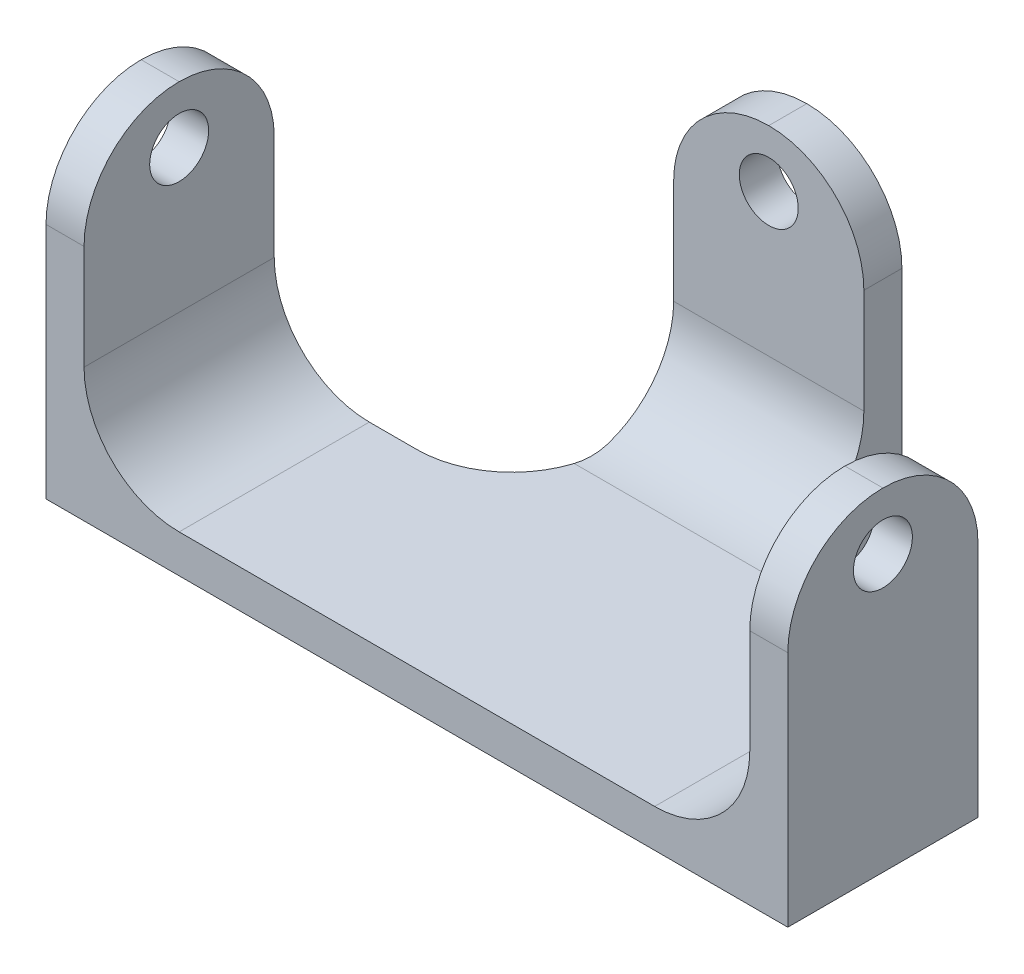
ISO-10303-21;
HEADER;
FILE_DESCRIPTION(('STEP AP214'),'2;1');
FILE_NAME('part.step','',(''),(''),'','','');
FILE_SCHEMA(('AUTOMOTIVE_DESIGN { 1 0 10303 214 1 1 1 1 }'));
ENDSEC;
DATA;
#1=APPLICATION_CONTEXT('core data for automotive mechanical design processes');
#2=APPLICATION_PROTOCOL_DEFINITION('international standard','automotive_design',2000,#1);
#3=PRODUCT_CONTEXT('',#1,'mechanical');
#4=PRODUCT('Part','Part','',(#3));
#5=PRODUCT_RELATED_PRODUCT_CATEGORY('part','',(#4));
#6=PRODUCT_DEFINITION_FORMATION('','',#4);
#7=PRODUCT_DEFINITION_CONTEXT('part definition',#1,'design');
#8=PRODUCT_DEFINITION('design','',#6,#7);
#9=PRODUCT_DEFINITION_SHAPE('','',#8);
#10=(LENGTH_UNIT() NAMED_UNIT(*) SI_UNIT(.MILLI.,.METRE.));
#11=(NAMED_UNIT(*) PLANE_ANGLE_UNIT() SI_UNIT($,.RADIAN.));
#12=(NAMED_UNIT(*) SI_UNIT($,.STERADIAN.) SOLID_ANGLE_UNIT());
#13=UNCERTAINTY_MEASURE_WITH_UNIT(LENGTH_MEASURE(1.E-05),#10,'distance_accuracy_value','');
#14=(GEOMETRIC_REPRESENTATION_CONTEXT(3) GLOBAL_UNCERTAINTY_ASSIGNED_CONTEXT((#13)) GLOBAL_UNIT_ASSIGNED_CONTEXT((#10,
#11,#12)) REPRESENTATION_CONTEXT('',''));
#15=CARTESIAN_POINT('',(0.,0.,0.));
#16=DIRECTION('',(0.,0.,1.));
#17=DIRECTION('',(1.,0.,0.));
#18=AXIS2_PLACEMENT_3D('',#15,#16,#17);
#19=CARTESIAN_POINT('',(-6.63941409911649,-24.1824796838979,62.));
#20=DIRECTION('',(0.,-1.,0.));
#21=DIRECTION('',(1.,0.,0.));
#22=AXIS2_PLACEMENT_3D('',#19,#20,#21);
#23=PLANE('',#22);
#24=DIRECTION('',(1.,0.,0.));
#25=VECTOR('',#24,1.);
#26=CARTESIAN_POINT('',(18.3605859008835,-24.1824796838979,14.));
#27=LINE('',#26,#25);
#28=CARTESIAN_POINT('',(38.821193886714,-24.1824796838979,14.));
#29=VERTEX_POINT('',#28);
#30=CARTESIAN_POINT('',(17.899977915053,-24.1824796838979,14.));
#31=VERTEX_POINT('',#30);
#32=EDGE_CURVE('E53',#29,#31,#27,.F.);
#33=ORIENTED_EDGE('',*,*,#32,.T.);
#34=CARTESIAN_POINT('',(8.36058590088351,-24.1824796838979,11.));
#35=DIRECTION('',(0.,-1.,0.));
#36=DIRECTION('',(1.,0.,0.));
#37=AXIS2_PLACEMENT_3D('',#34,#35,#36);
#38=CIRCLE('',#37,10.);
#39=CARTESIAN_POINT('',(8.36058590088351,-24.1824796838979,21.));
#40=VERTEX_POINT('',#39);
#41=EDGE_CURVE('E318',#31,#40,#38,.T.);
#42=ORIENTED_EDGE('',*,*,#41,.T.);
#43=DIRECTION('',(-1.,0.,0.));
#44=VECTOR('',#43,1.);
#45=CARTESIAN_POINT('',(-6.63941409911649,-24.1824796838979,21.));
#46=LINE('',#45,#44);
#47=CARTESIAN_POINT('',(3.3605859008835,-24.1824796838979,21.));
#48=VERTEX_POINT('',#47);
#49=EDGE_CURVE('E396',#40,#48,#46,.T.);
#50=ORIENTED_EDGE('',*,*,#49,.T.);
#51=DIRECTION('',(0.,0.,-1.));
#52=VECTOR('',#51,1.);
#53=CARTESIAN_POINT('',(3.3605859008835,-24.1824796838979,41.));
#54=LINE('',#53,#52);
#55=CARTESIAN_POINT('',(3.3605859008835,-24.1824796838979,41.));
#56=VERTEX_POINT('',#55);
#57=EDGE_CURVE('E274',#48,#56,#54,.F.);
#58=ORIENTED_EDGE('',*,*,#57,.T.);
#59=DIRECTION('',(1.,0.,0.));
#60=VECTOR('',#59,1.);
#61=CARTESIAN_POINT('',(-6.63941409911649,-24.1824796838979,41.));
#62=LINE('',#61,#60);
#63=CARTESIAN_POINT('',(53.3605859008835,-24.1824796838979,41.));
#64=VERTEX_POINT('',#63);
#65=EDGE_CURVE('E391',#56,#64,#62,.T.);
#66=ORIENTED_EDGE('',*,*,#65,.T.);
#67=DIRECTION('',(0.,0.,-1.));
#68=VECTOR('',#67,1.);
#69=CARTESIAN_POINT('',(53.3605859008835,-24.1824796838979,21.));
#70=LINE('',#69,#68);
#71=CARTESIAN_POINT('',(53.3605859008835,-24.1824796838979,21.));
#72=VERTEX_POINT('',#71);
#73=EDGE_CURVE('E270',#64,#72,#70,.T.);
#74=ORIENTED_EDGE('',*,*,#73,.T.);
#75=DIRECTION('',(-1.,0.,0.));
#76=VECTOR('',#75,1.);
#77=CARTESIAN_POINT('',(-6.63941409911649,-24.1824796838979,21.));
#78=LINE('',#77,#76);
#79=CARTESIAN_POINT('',(48.3605859008835,-24.1824796838979,21.));
#80=VERTEX_POINT('',#79);
#81=EDGE_CURVE('E406',#72,#80,#78,.T.);
#82=ORIENTED_EDGE('',*,*,#81,.T.);
#83=CARTESIAN_POINT('',(48.3605859008835,-24.1824796838979,11.));
#84=DIRECTION('',(0.,-1.,0.));
#85=DIRECTION('',(1.,0.,0.));
#86=AXIS2_PLACEMENT_3D('',#83,#84,#85);
#87=CIRCLE('',#86,10.);
#88=EDGE_CURVE('E47',#80,#29,#87,.T.);
#89=ORIENTED_EDGE('',*,*,#88,.T.);
#90=EDGE_LOOP('',(#33,#42,#50,#58,#66,#74,#82,#89));
#91=FACE_BOUND('',#90,.T.);
#92=ADVANCED_FACE('F33',(#91),#23,.F.);
#93=CARTESIAN_POINT('',(-10.6394140991165,-28.1824796838979,62.));
#94=DIRECTION('',(1.,0.,0.));
#95=DIRECTION('',(0.,1.,0.));
#96=AXIS2_PLACEMENT_3D('',#93,#94,#95);
#97=PLANE('',#96);
#98=CARTESIAN_POINT('',(-10.6394140991165,0.817520316102066,31.));
#99=DIRECTION('',(1.,0.,0.));
#100=DIRECTION('',(0.,1.,0.));
#101=AXIS2_PLACEMENT_3D('',#98,#99,#100);
#102=CIRCLE('',#101,3.1);
#103=CARTESIAN_POINT('',(-10.6394140991165,3.91752031610207,31.));
#104=VERTEX_POINT('',#103);
#105=EDGE_CURVE('E223',#104,#104,#102,.T.);
#106=ORIENTED_EDGE('',*,*,#105,.T.);
#107=EDGE_LOOP('',(#106));
#108=FACE_BOUND('',#107,.T.);
#109=CARTESIAN_POINT('',(-10.6394140991165,-3.18247968389794,31.));
#110=DIRECTION('',(1.,0.,0.));
#111=DIRECTION('',(0.,1.,0.));
#112=AXIS2_PLACEMENT_3D('',#109,#110,#111);
#113=CIRCLE('',#112,10.);
#114=CARTESIAN_POINT('',(-10.6394140991165,-3.18247968389794,41.));
#115=VERTEX_POINT('',#114);
#116=CARTESIAN_POINT('',(-10.6394140991165,6.81752031610207,31.));
#117=VERTEX_POINT('',#116);
#118=EDGE_CURVE('E240',#115,#117,#113,.F.);
#119=ORIENTED_EDGE('',*,*,#118,.T.);
#120=CARTESIAN_POINT('',(-10.6394140991165,-3.18247968389794,31.));
#121=DIRECTION('',(1.,0.,0.));
#122=DIRECTION('',(0.,1.,0.));
#123=AXIS2_PLACEMENT_3D('',#120,#121,#122);
#124=CIRCLE('',#123,10.);
#125=CARTESIAN_POINT('',(-10.6394140991165,-3.18247968389794,21.));
#126=VERTEX_POINT('',#125);
#127=EDGE_CURVE('E242',#117,#126,#124,.F.);
#128=ORIENTED_EDGE('',*,*,#127,.T.);
#129=DIRECTION('',(0.,-1.,0.));
#130=VECTOR('',#129,1.);
#131=CARTESIAN_POINT('',(-10.6394140991165,6.81752031610207,21.));
#132=LINE('',#131,#130);
#133=CARTESIAN_POINT('',(-10.6394140991165,-28.1824796838979,21.));
#134=VERTEX_POINT('',#133);
#135=EDGE_CURVE('E206',#126,#134,#132,.T.);
#136=ORIENTED_EDGE('',*,*,#135,.T.);
#137=DIRECTION('',(0.,0.,-1.));
#138=VECTOR('',#137,1.);
#139=CARTESIAN_POINT('',(-10.6394140991165,-28.1824796838979,62.));
#140=LINE('',#139,#138);
#141=CARTESIAN_POINT('',(-10.6394140991165,-28.1824796838979,41.));
#142=VERTEX_POINT('',#141);
#143=EDGE_CURVE('E202',#142,#134,#140,.T.);
#144=ORIENTED_EDGE('',*,*,#143,.F.);
#145=DIRECTION('',(0.,-1.,0.));
#146=VECTOR('',#145,1.);
#147=CARTESIAN_POINT('',(-10.6394140991165,6.81752031610207,41.));
#148=LINE('',#147,#146);
#149=EDGE_CURVE('E184',#115,#142,#148,.T.);
#150=ORIENTED_EDGE('',*,*,#149,.F.);
#151=EDGE_LOOP('',(#119,#128,#136,#144,#150));
#152=FACE_BOUND('',#151,.T.);
#153=ADVANCED_FACE('F209',(#108,#152),#97,.F.);
#154=CARTESIAN_POINT('',(67.3605859008835,-28.1824796838979,62.));
#155=DIRECTION('',(0.,1.,0.));
#156=DIRECTION('',(-1.,0.,0.));
#157=AXIS2_PLACEMENT_3D('',#154,#155,#156);
#158=PLANE('',#157);
#159=DIRECTION('',(0.,0.,-1.));
#160=VECTOR('',#159,1.);
#161=CARTESIAN_POINT('',(67.3605859008835,-28.1824796838979,62.));
#162=LINE('',#161,#160);
#163=CARTESIAN_POINT('',(67.3605859008835,-28.1824796838979,41.));
#164=VERTEX_POINT('',#163);
#165=CARTESIAN_POINT('',(67.3605859008835,-28.1824796838979,21.));
#166=VERTEX_POINT('',#165);
#167=EDGE_CURVE('E205',#164,#166,#162,.T.);
#168=ORIENTED_EDGE('',*,*,#167,.F.);
#169=DIRECTION('',(1.,0.,0.));
#170=VECTOR('',#169,1.);
#171=CARTESIAN_POINT('',(-10.6394140991165,-28.1824796838979,41.));
#172=LINE('',#171,#170);
#173=EDGE_CURVE('E188',#142,#164,#172,.T.);
#174=ORIENTED_EDGE('',*,*,#173,.F.);
#175=ORIENTED_EDGE('',*,*,#143,.T.);
#176=DIRECTION('',(-1.,0.,0.));
#177=VECTOR('',#176,1.);
#178=CARTESIAN_POINT('',(-10.6394140991165,-28.1824796838979,21.));
#179=LINE('',#178,#177);
#180=CARTESIAN_POINT('',(8.36058590088351,-28.1824796838979,21.));
#181=VERTEX_POINT('',#180);
#182=EDGE_CURVE('E442',#181,#134,#179,.T.);
#183=ORIENTED_EDGE('',*,*,#182,.F.);
#184=CARTESIAN_POINT('',(8.36058590088351,-28.1824796838979,11.));
#185=DIRECTION('',(0.,1.,0.));
#186=DIRECTION('',(-1.,0.,0.));
#187=AXIS2_PLACEMENT_3D('',#184,#185,#186);
#188=CIRCLE('',#187,10.);
#189=CARTESIAN_POINT('',(18.3605859008835,-28.1824796838979,11.));
#190=VERTEX_POINT('',#189);
#191=EDGE_CURVE('E310',#181,#190,#188,.T.);
#192=ORIENTED_EDGE('',*,*,#191,.T.);
#193=DIRECTION('',(0.,0.,1.));
#194=VECTOR('',#193,1.);
#195=CARTESIAN_POINT('',(18.3605859008835,-28.1824796838979,0.));
#196=LINE('',#195,#194);
#197=CARTESIAN_POINT('',(18.3605859008835,-28.1824796838979,0.));
#198=VERTEX_POINT('',#197);
#199=EDGE_CURVE('E427',#198,#190,#196,.T.);
#200=ORIENTED_EDGE('',*,*,#199,.F.);
#201=DIRECTION('',(1.,0.,0.));
#202=VECTOR('',#201,1.);
#203=CARTESIAN_POINT('',(67.3605859008835,-28.1824796838979,0.));
#204=LINE('',#203,#202);
#205=CARTESIAN_POINT('',(38.3605859008835,-28.1824796838979,0.));
#206=VERTEX_POINT('',#205);
#207=EDGE_CURVE('E216',#198,#206,#204,.T.);
#208=ORIENTED_EDGE('',*,*,#207,.T.);
#209=DIRECTION('',(0.,0.,-1.));
#210=VECTOR('',#209,1.);
#211=CARTESIAN_POINT('',(38.3605859008835,-28.1824796838979,0.));
#212=LINE('',#211,#210);
#213=CARTESIAN_POINT('',(38.3605859008835,-28.1824796838979,11.));
#214=VERTEX_POINT('',#213);
#215=EDGE_CURVE('E425',#214,#206,#212,.T.);
#216=ORIENTED_EDGE('',*,*,#215,.F.);
#217=CARTESIAN_POINT('',(48.3605859008835,-28.1824796838979,11.));
#218=DIRECTION('',(0.,1.,0.));
#219=DIRECTION('',(-1.,0.,0.));
#220=AXIS2_PLACEMENT_3D('',#217,#218,#219);
#221=CIRCLE('',#220,10.);
#222=CARTESIAN_POINT('',(48.3605859008835,-28.1824796838979,21.));
#223=VERTEX_POINT('',#222);
#224=EDGE_CURVE('E471',#214,#223,#221,.T.);
#225=ORIENTED_EDGE('',*,*,#224,.T.);
#226=DIRECTION('',(-1.,0.,0.));
#227=VECTOR('',#226,1.);
#228=CARTESIAN_POINT('',(67.3605859008835,-28.1824796838979,21.));
#229=LINE('',#228,#227);
#230=EDGE_CURVE('E294',#166,#223,#229,.T.);
#231=ORIENTED_EDGE('',*,*,#230,.F.);
#232=EDGE_LOOP('',(#168,#174,#175,#183,#192,#200,#208,#216,#225,#231));
#233=FACE_BOUND('',#232,.T.);
#234=ADVANCED_FACE('F200',(#233),#158,.F.);
#235=CARTESIAN_POINT('',(67.3605859008835,6.81752031610207,62.));
#236=DIRECTION('',(-1.,0.,0.));
#237=DIRECTION('',(0.,0.,1.));
#238=AXIS2_PLACEMENT_3D('',#235,#236,#237);
#239=PLANE('',#238);
#240=CARTESIAN_POINT('',(67.3605859008835,0.817520316102085,31.));
#241=DIRECTION('',(1.,0.,0.));
#242=DIRECTION('',(0.,1.,0.));
#243=AXIS2_PLACEMENT_3D('',#240,#241,#242);
#244=CIRCLE('',#243,3.1);
#245=CARTESIAN_POINT('',(67.3605859008835,3.91752031610209,31.));
#246=VERTEX_POINT('',#245);
#247=EDGE_CURVE('E413',#246,#246,#244,.T.);
#248=ORIENTED_EDGE('',*,*,#247,.F.);
#249=EDGE_LOOP('',(#248));
#250=FACE_BOUND('',#249,.T.);
#251=CARTESIAN_POINT('',(67.3605859008835,-3.18247968389793,31.));
#252=DIRECTION('',(-1.,0.,0.));
#253=DIRECTION('',(0.,0.,1.));
#254=AXIS2_PLACEMENT_3D('',#251,#252,#253);
#255=CIRCLE('',#254,10.);
#256=CARTESIAN_POINT('',(67.3605859008835,-3.18247968389793,21.));
#257=VERTEX_POINT('',#256);
#258=CARTESIAN_POINT('',(67.3605859008835,6.81752031610207,31.));
#259=VERTEX_POINT('',#258);
#260=EDGE_CURVE('E214',#257,#259,#255,.F.);
#261=ORIENTED_EDGE('',*,*,#260,.T.);
#262=CARTESIAN_POINT('',(67.3605859008835,-3.18247968389793,31.));
#263=DIRECTION('',(-1.,0.,0.));
#264=DIRECTION('',(0.,0.,1.));
#265=AXIS2_PLACEMENT_3D('',#262,#263,#264);
#266=CIRCLE('',#265,10.);
#267=CARTESIAN_POINT('',(67.3605859008835,-3.18247968389793,41.));
#268=VERTEX_POINT('',#267);
#269=EDGE_CURVE('E226',#259,#268,#266,.F.);
#270=ORIENTED_EDGE('',*,*,#269,.T.);
#271=DIRECTION('',(0.,-1.,0.));
#272=VECTOR('',#271,1.);
#273=CARTESIAN_POINT('',(67.3605859008835,6.81752031610208,41.));
#274=LINE('',#273,#272);
#275=EDGE_CURVE('E196',#268,#164,#274,.T.);
#276=ORIENTED_EDGE('',*,*,#275,.T.);
#277=ORIENTED_EDGE('',*,*,#167,.T.);
#278=DIRECTION('',(0.,-1.,0.));
#279=VECTOR('',#278,1.);
#280=CARTESIAN_POINT('',(67.3605859008835,6.81752031610208,21.));
#281=LINE('',#280,#279);
#282=EDGE_CURVE('E440',#257,#166,#281,.T.);
#283=ORIENTED_EDGE('',*,*,#282,.F.);
#284=EDGE_LOOP('',(#261,#270,#276,#277,#283));
#285=FACE_BOUND('',#284,.T.);
#286=ADVANCED_FACE('F350',(#250,#285),#239,.F.);
#287=CARTESIAN_POINT('',(63.3605859008835,-24.1824796838979,62.));
#288=DIRECTION('',(1.,0.,0.));
#289=DIRECTION('',(0.,0.,-1.));
#290=AXIS2_PLACEMENT_3D('',#287,#288,#289);
#291=PLANE('',#290);
#292=CARTESIAN_POINT('',(63.3605859008835,0.817520316102084,31.));
#293=DIRECTION('',(1.,0.,0.));
#294=DIRECTION('',(0.,0.,-1.));
#295=AXIS2_PLACEMENT_3D('',#292,#293,#294);
#296=CIRCLE('',#295,3.1);
#297=CARTESIAN_POINT('',(63.3605859008835,0.817520316102084,27.9));
#298=VERTEX_POINT('',#297);
#299=EDGE_CURVE('E222',#298,#298,#296,.T.);
#300=ORIENTED_EDGE('',*,*,#299,.T.);
#301=EDGE_LOOP('',(#300));
#302=FACE_BOUND('',#301,.T.);
#303=DIRECTION('',(0.,1.,0.));
#304=VECTOR('',#303,1.);
#305=CARTESIAN_POINT('',(63.3605859008835,-24.1824796838979,41.));
#306=LINE('',#305,#304);
#307=CARTESIAN_POINT('',(63.3605859008835,-14.1824796838979,41.));
#308=VERTEX_POINT('',#307);
#309=CARTESIAN_POINT('',(63.3605859008835,-3.18247968389793,41.));
#310=VERTEX_POINT('',#309);
#311=EDGE_CURVE('E398',#308,#310,#306,.T.);
#312=ORIENTED_EDGE('',*,*,#311,.T.);
#313=CARTESIAN_POINT('',(63.3605859008835,-3.18247968389793,31.));
#314=DIRECTION('',(1.,0.,0.));
#315=DIRECTION('',(0.,0.,-1.));
#316=AXIS2_PLACEMENT_3D('',#313,#314,#315);
#317=CIRCLE('',#316,10.);
#318=CARTESIAN_POINT('',(63.3605859008835,6.81752031610207,31.));
#319=VERTEX_POINT('',#318);
#320=EDGE_CURVE('E236',#310,#319,#317,.F.);
#321=ORIENTED_EDGE('',*,*,#320,.T.);
#322=CARTESIAN_POINT('',(63.3605859008835,-3.18247968389793,31.));
#323=DIRECTION('',(1.,0.,0.));
#324=DIRECTION('',(0.,0.,-1.));
#325=AXIS2_PLACEMENT_3D('',#322,#323,#324);
#326=CIRCLE('',#325,10.);
#327=CARTESIAN_POINT('',(63.3605859008835,-3.18247968389793,21.));
#328=VERTEX_POINT('',#327);
#329=EDGE_CURVE('E234',#319,#328,#326,.F.);
#330=ORIENTED_EDGE('',*,*,#329,.T.);
#331=DIRECTION('',(0.,-1.,0.));
#332=VECTOR('',#331,1.);
#333=CARTESIAN_POINT('',(63.3605859008835,-24.1824796838979,21.));
#334=LINE('',#333,#332);
#335=CARTESIAN_POINT('',(63.3605859008835,-14.1824796838979,21.));
#336=VERTEX_POINT('',#335);
#337=EDGE_CURVE('E211',#328,#336,#334,.T.);
#338=ORIENTED_EDGE('',*,*,#337,.T.);
#339=DIRECTION('',(0.,0.,-1.));
#340=VECTOR('',#339,1.);
#341=CARTESIAN_POINT('',(63.3605859008835,-14.1824796838979,41.));
#342=LINE('',#341,#340);
#343=EDGE_CURVE('E232',#336,#308,#342,.F.);
#344=ORIENTED_EDGE('',*,*,#343,.T.);
#345=EDGE_LOOP('',(#312,#321,#330,#338,#344));
#346=FACE_BOUND('',#345,.T.);
#347=ADVANCED_FACE('F347',(#302,#346),#291,.F.);
#348=CARTESIAN_POINT('',(-6.6394140991165,6.81752031610207,62.));
#349=DIRECTION('',(-1.,0.,0.));
#350=DIRECTION('',(0.,-1.,0.));
#351=AXIS2_PLACEMENT_3D('',#348,#349,#350);
#352=PLANE('',#351);
#353=CARTESIAN_POINT('',(-6.6394140991165,0.817520316102067,31.));
#354=DIRECTION('',(-1.,0.,0.));
#355=DIRECTION('',(0.,-1.,0.));
#356=AXIS2_PLACEMENT_3D('',#353,#354,#355);
#357=CIRCLE('',#356,3.1);
#358=CARTESIAN_POINT('',(-6.6394140991165,-2.28247968389794,31.));
#359=VERTEX_POINT('',#358);
#360=EDGE_CURVE('E220',#359,#359,#357,.T.);
#361=ORIENTED_EDGE('',*,*,#360,.T.);
#362=EDGE_LOOP('',(#361));
#363=FACE_BOUND('',#362,.T.);
#364=DIRECTION('',(0.,1.,0.));
#365=VECTOR('',#364,1.);
#366=CARTESIAN_POINT('',(-6.6394140991165,6.81752031610207,21.));
#367=LINE('',#366,#365);
#368=CARTESIAN_POINT('',(-6.6394140991165,-14.1824796838979,21.));
#369=VERTEX_POINT('',#368);
#370=CARTESIAN_POINT('',(-6.6394140991165,-3.18247968389794,21.));
#371=VERTEX_POINT('',#370);
#372=EDGE_CURVE('E400',#369,#371,#367,.T.);
#373=ORIENTED_EDGE('',*,*,#372,.T.);
#374=CARTESIAN_POINT('',(-6.6394140991165,-3.18247968389794,31.));
#375=DIRECTION('',(-1.,0.,0.));
#376=DIRECTION('',(0.,-1.,0.));
#377=AXIS2_PLACEMENT_3D('',#374,#375,#376);
#378=CIRCLE('',#377,10.);
#379=CARTESIAN_POINT('',(-6.6394140991165,6.81752031610207,31.));
#380=VERTEX_POINT('',#379);
#381=EDGE_CURVE('E252',#371,#380,#378,.F.);
#382=ORIENTED_EDGE('',*,*,#381,.T.);
#383=CARTESIAN_POINT('',(-6.6394140991165,-3.18247968389794,31.));
#384=DIRECTION('',(-1.,0.,0.));
#385=DIRECTION('',(0.,-1.,0.));
#386=AXIS2_PLACEMENT_3D('',#383,#384,#385);
#387=CIRCLE('',#386,10.);
#388=CARTESIAN_POINT('',(-6.6394140991165,-3.18247968389794,41.));
#389=VERTEX_POINT('',#388);
#390=EDGE_CURVE('E250',#380,#389,#387,.F.);
#391=ORIENTED_EDGE('',*,*,#390,.T.);
#392=DIRECTION('',(0.,-1.,0.));
#393=VECTOR('',#392,1.);
#394=CARTESIAN_POINT('',(-6.6394140991165,6.81752031610207,41.));
#395=LINE('',#394,#393);
#396=CARTESIAN_POINT('',(-6.6394140991165,-14.1824796838979,41.));
#397=VERTEX_POINT('',#396);
#398=EDGE_CURVE('E389',#389,#397,#395,.T.);
#399=ORIENTED_EDGE('',*,*,#398,.T.);
#400=DIRECTION('',(0.,0.,-1.));
#401=VECTOR('',#400,1.);
#402=CARTESIAN_POINT('',(-6.6394140991165,-14.1824796838979,21.));
#403=LINE('',#402,#401);
#404=EDGE_CURVE('E247',#397,#369,#403,.T.);
#405=ORIENTED_EDGE('',*,*,#404,.T.);
#406=EDGE_LOOP('',(#373,#382,#391,#399,#405));
#407=FACE_BOUND('',#406,.T.);
#408=ADVANCED_FACE('F345',(#363,#407),#352,.F.);
#409=CARTESIAN_POINT('',(0.,0.,0.));
#410=DIRECTION('',(0.,0.,-1.));
#411=DIRECTION('',(-1.,0.,0.));
#412=AXIS2_PLACEMENT_3D('',#409,#410,#411);
#413=PLANE('',#412);
#414=CARTESIAN_POINT('',(28.3605859008835,-3.18247968389794,0.));
#415=DIRECTION('',(0.,0.,-1.));
#416=DIRECTION('',(-1.,0.,0.));
#417=AXIS2_PLACEMENT_3D('',#414,#415,#416);
#418=CIRCLE('',#417,10.);
#419=CARTESIAN_POINT('',(18.3605859008835,-3.18247968389794,0.));
#420=VERTEX_POINT('',#419);
#421=CARTESIAN_POINT('',(28.3605859008835,6.81752031610206,0.));
#422=VERTEX_POINT('',#421);
#423=EDGE_CURVE('E264',#420,#422,#418,.T.);
#424=ORIENTED_EDGE('',*,*,#423,.T.);
#425=CARTESIAN_POINT('',(28.3605859008835,-3.18247968389794,0.));
#426=DIRECTION('',(0.,0.,-1.));
#427=DIRECTION('',(-1.,0.,0.));
#428=AXIS2_PLACEMENT_3D('',#425,#426,#427);
#429=CIRCLE('',#428,10.);
#430=CARTESIAN_POINT('',(38.3605859008835,-3.18247968389794,0.));
#431=VERTEX_POINT('',#430);
#432=EDGE_CURVE('E266',#422,#431,#429,.T.);
#433=ORIENTED_EDGE('',*,*,#432,.T.);
#434=DIRECTION('',(0.,-1.,0.));
#435=VECTOR('',#434,1.);
#436=CARTESIAN_POINT('',(38.3605859008835,6.81752031610208,0.));
#437=LINE('',#436,#435);
#438=EDGE_CURVE('E436',#431,#206,#437,.T.);
#439=ORIENTED_EDGE('',*,*,#438,.T.);
#440=ORIENTED_EDGE('',*,*,#207,.F.);
#441=DIRECTION('',(0.,-1.,0.));
#442=VECTOR('',#441,1.);
#443=CARTESIAN_POINT('',(18.3605859008835,6.81752031610208,0.));
#444=LINE('',#443,#442);
#445=EDGE_CURVE('E433',#420,#198,#444,.T.);
#446=ORIENTED_EDGE('',*,*,#445,.F.);
#447=EDGE_LOOP('',(#424,#433,#439,#440,#446));
#448=FACE_BOUND('',#447,.T.);
#449=CARTESIAN_POINT('',(28.3605859008835,0.817520316102064,0.));
#450=DIRECTION('',(0.,0.,1.));
#451=DIRECTION('',(1.,0.,0.));
#452=AXIS2_PLACEMENT_3D('',#449,#450,#451);
#453=CIRCLE('',#452,3.1);
#454=CARTESIAN_POINT('',(31.4605859008835,0.817520316102064,0.));
#455=VERTEX_POINT('',#454);
#456=EDGE_CURVE('E410',#455,#455,#453,.T.);
#457=ORIENTED_EDGE('',*,*,#456,.T.);
#458=EDGE_LOOP('',(#457));
#459=FACE_BOUND('',#458,.T.);
#460=ADVANCED_FACE('F431',(#448,#459),#413,.T.);
#461=CARTESIAN_POINT('',(-2.63941409911649,6.81752031610206,4.00000000000001));
#462=DIRECTION('',(0.,0.,-1.));
#463=DIRECTION('',(-1.,0.,0.));
#464=AXIS2_PLACEMENT_3D('',#461,#462,#463);
#465=PLANE('',#464);
#466=CARTESIAN_POINT('',(28.3605859008835,0.817520316102064,4.00000000000001));
#467=DIRECTION('',(0.,0.,1.));
#468=DIRECTION('',(1.,0.,0.));
#469=AXIS2_PLACEMENT_3D('',#466,#467,#468);
#470=CIRCLE('',#469,3.1);
#471=CARTESIAN_POINT('',(31.4605859008835,0.817520316102064,4.00000000000001));
#472=VERTEX_POINT('',#471);
#473=EDGE_CURVE('E409',#472,#472,#470,.T.);
#474=ORIENTED_EDGE('',*,*,#473,.F.);
#475=EDGE_LOOP('',(#474));
#476=FACE_BOUND('',#475,.T.);
#477=DIRECTION('',(0.,1.,0.));
#478=VECTOR('',#477,1.);
#479=CARTESIAN_POINT('',(38.3605859008835,6.81752031610207,4.));
#480=LINE('',#479,#478);
#481=CARTESIAN_POINT('',(38.3605859008835,-14.1824796838979,4.));
#482=VERTEX_POINT('',#481);
#483=CARTESIAN_POINT('',(38.3605859008835,-3.18247968389794,4.));
#484=VERTEX_POINT('',#483);
#485=EDGE_CURVE('E448',#482,#484,#480,.T.);
#486=ORIENTED_EDGE('',*,*,#485,.T.);
#487=CARTESIAN_POINT('',(28.3605859008835,-3.18247968389794,4.00000000000001));
#488=DIRECTION('',(0.,0.,-1.));
#489=DIRECTION('',(-1.,0.,0.));
#490=AXIS2_PLACEMENT_3D('',#487,#488,#489);
#491=CIRCLE('',#490,10.);
#492=CARTESIAN_POINT('',(28.3605859008835,6.81752031610206,4.00000000000001));
#493=VERTEX_POINT('',#492);
#494=EDGE_CURVE('E262',#484,#493,#491,.F.);
#495=ORIENTED_EDGE('',*,*,#494,.T.);
#496=CARTESIAN_POINT('',(28.3605859008835,-3.18247968389794,4.00000000000001));
#497=DIRECTION('',(0.,0.,-1.));
#498=DIRECTION('',(-1.,0.,0.));
#499=AXIS2_PLACEMENT_3D('',#496,#497,#498);
#500=CIRCLE('',#499,10.);
#501=CARTESIAN_POINT('',(18.3605859008835,-3.18247968389794,4.00000000000001));
#502=VERTEX_POINT('',#501);
#503=EDGE_CURVE('E260',#493,#502,#500,.F.);
#504=ORIENTED_EDGE('',*,*,#503,.T.);
#505=DIRECTION('',(0.,-1.,0.));
#506=VECTOR('',#505,1.);
#507=CARTESIAN_POINT('',(18.3605859008835,6.81752031610206,4.00000000000001));
#508=LINE('',#507,#506);
#509=CARTESIAN_POINT('',(18.3605859008835,-14.1824796838979,4.00000000000001));
#510=VERTEX_POINT('',#509);
#511=EDGE_CURVE('E451',#502,#510,#508,.T.);
#512=ORIENTED_EDGE('',*,*,#511,.T.);
#513=DIRECTION('',(1.,0.,0.));
#514=VECTOR('',#513,1.);
#515=CARTESIAN_POINT('',(38.3605859008835,-14.1824796838979,4.00000000000001));
#516=LINE('',#515,#514);
#517=EDGE_CURVE('E257',#510,#482,#516,.T.);
#518=ORIENTED_EDGE('',*,*,#517,.T.);
#519=EDGE_LOOP('',(#486,#495,#504,#512,#518));
#520=FACE_BOUND('',#519,.T.);
#521=ADVANCED_FACE('F484',(#476,#520),#465,.F.);
#522=CARTESIAN_POINT('',(-10.6394140991165,0.817520316102066,31.));
#523=DIRECTION('',(1.,0.,0.));
#524=DIRECTION('',(0.,1.,0.));
#525=AXIS2_PLACEMENT_3D('',#522,#523,#524);
#526=CYLINDRICAL_SURFACE('',#525,3.1);
#527=ORIENTED_EDGE('',*,*,#105,.F.);
#528=EDGE_LOOP('',(#527));
#529=FACE_BOUND('',#528,.T.);
#530=ORIENTED_EDGE('',*,*,#360,.F.);
#531=EDGE_LOOP('',(#530));
#532=FACE_BOUND('',#531,.T.);
#533=ADVANCED_FACE('F487',(#529,#532),#526,.F.);
#534=ORIENTED_EDGE('',*,*,#247,.T.);
#535=EDGE_LOOP('',(#534));
#536=FACE_BOUND('',#535,.T.);
#537=ORIENTED_EDGE('',*,*,#299,.F.);
#538=EDGE_LOOP('',(#537));
#539=FACE_BOUND('',#538,.T.);
#540=ADVANCED_FACE('F494',(#536,#539),#526,.F.);
#541=CARTESIAN_POINT('',(28.3605859008835,0.817520316102064,0.));
#542=DIRECTION('',(0.,0.,1.));
#543=DIRECTION('',(1.,0.,0.));
#544=AXIS2_PLACEMENT_3D('',#541,#542,#543);
#545=CYLINDRICAL_SURFACE('',#544,3.1);
#546=ORIENTED_EDGE('',*,*,#456,.F.);
#547=EDGE_LOOP('',(#546));
#548=FACE_BOUND('',#547,.T.);
#549=ORIENTED_EDGE('',*,*,#473,.T.);
#550=EDGE_LOOP('',(#549));
#551=FACE_BOUND('',#550,.T.);
#552=ADVANCED_FACE('F500',(#548,#551),#545,.F.);
#553=CARTESIAN_POINT('',(67.3605859008835,6.81752031610208,21.));
#554=DIRECTION('',(0.,0.,1.));
#555=DIRECTION('',(1.,0.,0.));
#556=AXIS2_PLACEMENT_3D('',#553,#554,#555);
#557=PLANE('',#556);
#558=ORIENTED_EDGE('',*,*,#230,.T.);
#559=DIRECTION('',(0.,-1.,0.));
#560=VECTOR('',#559,1.);
#561=CARTESIAN_POINT('',(48.3605859008835,-24.1824796838979,21.));
#562=LINE('',#561,#560);
#563=EDGE_CURVE('E308',#223,#80,#562,.F.);
#564=ORIENTED_EDGE('',*,*,#563,.T.);
#565=ORIENTED_EDGE('',*,*,#81,.F.);
#566=CARTESIAN_POINT('',(53.3605859008835,-14.1824796838979,21.));
#567=DIRECTION('',(0.,0.,1.));
#568=DIRECTION('',(1.,0.,0.));
#569=AXIS2_PLACEMENT_3D('',#566,#567,#568);
#570=CIRCLE('',#569,10.);
#571=EDGE_CURVE('E286',#72,#336,#570,.T.);
#572=ORIENTED_EDGE('',*,*,#571,.T.);
#573=ORIENTED_EDGE('',*,*,#337,.F.);
#574=DIRECTION('',(-1.,0.,0.));
#575=VECTOR('',#574,1.);
#576=CARTESIAN_POINT('',(67.3605859008835,-3.18247968389793,21.));
#577=LINE('',#576,#575);
#578=EDGE_CURVE('E238',#328,#257,#577,.F.);
#579=ORIENTED_EDGE('',*,*,#578,.T.);
#580=ORIENTED_EDGE('',*,*,#282,.T.);
#581=EDGE_LOOP('',(#558,#564,#565,#572,#573,#579,#580));
#582=FACE_BOUND('',#581,.T.);
#583=ADVANCED_FACE('F504',(#582),#557,.F.);
#584=CARTESIAN_POINT('',(38.3605859008835,6.81752031610208,0.));
#585=DIRECTION('',(-1.,0.,0.));
#586=DIRECTION('',(0.,-1.,0.));
#587=AXIS2_PLACEMENT_3D('',#584,#585,#586);
#588=PLANE('',#587);
#589=CARTESIAN_POINT('',(38.3605859008835,-14.1824796838979,14.));
#590=DIRECTION('',(-1.,0.,0.));
#591=DIRECTION('',(0.,-1.,0.));
#592=AXIS2_PLACEMENT_3D('',#589,#590,#591);
#593=CIRCLE('',#592,10.);
#594=CARTESIAN_POINT('',(38.3605859008835,-23.7218716980674,11.));
#595=VERTEX_POINT('',#594);
#596=EDGE_CURVE('E281',#482,#595,#593,.T.);
#597=ORIENTED_EDGE('',*,*,#596,.T.);
#598=DIRECTION('',(0.,-1.,0.));
#599=VECTOR('',#598,1.);
#600=CARTESIAN_POINT('',(38.3605859008835,-28.1824796838979,11.));
#601=LINE('',#600,#599);
#602=EDGE_CURVE('E305',#595,#214,#601,.T.);
#603=ORIENTED_EDGE('',*,*,#602,.T.);
#604=ORIENTED_EDGE('',*,*,#215,.T.);
#605=ORIENTED_EDGE('',*,*,#438,.F.);
#606=DIRECTION('',(0.,0.,1.));
#607=VECTOR('',#606,1.);
#608=CARTESIAN_POINT('',(38.3605859008835,-3.18247968389794,4.00000000000001));
#609=LINE('',#608,#607);
#610=EDGE_CURVE('E254',#431,#484,#609,.T.);
#611=ORIENTED_EDGE('',*,*,#610,.T.);
#612=ORIENTED_EDGE('',*,*,#485,.F.);
#613=EDGE_LOOP('',(#597,#603,#604,#605,#611,#612));
#614=FACE_BOUND('',#613,.T.);
#615=ADVANCED_FACE('F465',(#614),#588,.F.);
#616=CARTESIAN_POINT('',(-10.6394140991165,6.81752031610207,21.));
#617=DIRECTION('',(0.,0.,1.));
#618=DIRECTION('',(1.,0.,0.));
#619=AXIS2_PLACEMENT_3D('',#616,#617,#618);
#620=PLANE('',#619);
#621=ORIENTED_EDGE('',*,*,#49,.F.);
#622=DIRECTION('',(0.,-1.,0.));
#623=VECTOR('',#622,1.);
#624=CARTESIAN_POINT('',(8.36058590088351,-28.1824796838979,21.));
#625=LINE('',#624,#623);
#626=EDGE_CURVE('E290',#40,#181,#625,.T.);
#627=ORIENTED_EDGE('',*,*,#626,.T.);
#628=ORIENTED_EDGE('',*,*,#182,.T.);
#629=ORIENTED_EDGE('',*,*,#135,.F.);
#630=DIRECTION('',(-1.,0.,0.));
#631=VECTOR('',#630,1.);
#632=CARTESIAN_POINT('',(-10.6394140991165,-3.18247968389794,21.));
#633=LINE('',#632,#631);
#634=EDGE_CURVE('E244',#126,#371,#633,.F.);
#635=ORIENTED_EDGE('',*,*,#634,.T.);
#636=ORIENTED_EDGE('',*,*,#372,.F.);
#637=CARTESIAN_POINT('',(3.3605859008835,-14.1824796838979,21.));
#638=DIRECTION('',(0.,0.,1.));
#639=DIRECTION('',(1.,0.,0.));
#640=AXIS2_PLACEMENT_3D('',#637,#638,#639);
#641=CIRCLE('',#640,10.);
#642=EDGE_CURVE('E276',#369,#48,#641,.T.);
#643=ORIENTED_EDGE('',*,*,#642,.T.);
#644=EDGE_LOOP('',(#621,#627,#628,#629,#635,#636,#643));
#645=FACE_BOUND('',#644,.T.);
#646=ADVANCED_FACE('F455',(#645),#620,.F.);
#647=CARTESIAN_POINT('',(18.3605859008835,6.81752031610208,0.));
#648=DIRECTION('',(1.,0.,0.));
#649=DIRECTION('',(0.,1.,0.));
#650=AXIS2_PLACEMENT_3D('',#647,#648,#649);
#651=PLANE('',#650);
#652=ORIENTED_EDGE('',*,*,#199,.T.);
#653=DIRECTION('',(0.,-1.,0.));
#654=VECTOR('',#653,1.);
#655=CARTESIAN_POINT('',(18.3605859008835,-24.1824796838979,11.));
#656=LINE('',#655,#654);
#657=CARTESIAN_POINT('',(18.3605859008835,-23.7218716980674,11.));
#658=VERTEX_POINT('',#657);
#659=EDGE_CURVE('E303',#190,#658,#656,.F.);
#660=ORIENTED_EDGE('',*,*,#659,.T.);
#661=CARTESIAN_POINT('',(18.3605859008835,-14.1824796838979,14.));
#662=DIRECTION('',(1.,0.,0.));
#663=DIRECTION('',(0.,1.,0.));
#664=AXIS2_PLACEMENT_3D('',#661,#662,#663);
#665=CIRCLE('',#664,10.);
#666=EDGE_CURVE('E284',#658,#510,#665,.T.);
#667=ORIENTED_EDGE('',*,*,#666,.T.);
#668=ORIENTED_EDGE('',*,*,#511,.F.);
#669=DIRECTION('',(0.,0.,1.));
#670=VECTOR('',#669,1.);
#671=CARTESIAN_POINT('',(18.3605859008835,-3.18247968389794,0.));
#672=LINE('',#671,#670);
#673=EDGE_CURVE('E268',#502,#420,#672,.F.);
#674=ORIENTED_EDGE('',*,*,#673,.T.);
#675=ORIENTED_EDGE('',*,*,#445,.T.);
#676=EDGE_LOOP('',(#652,#660,#667,#668,#674,#675));
#677=FACE_BOUND('',#676,.T.);
#678=ADVANCED_FACE('F477',(#677),#651,.F.);
#679=CARTESIAN_POINT('',(-10.6394140991165,6.81752031610207,41.));
#680=DIRECTION('',(0.,0.,-1.));
#681=DIRECTION('',(-1.,0.,0.));
#682=AXIS2_PLACEMENT_3D('',#679,#680,#681);
#683=PLANE('',#682);
#684=ORIENTED_EDGE('',*,*,#275,.F.);
#685=DIRECTION('',(1.,0.,0.));
#686=VECTOR('',#685,1.);
#687=CARTESIAN_POINT('',(-10.6394140991165,-3.18247968389796,41.));
#688=LINE('',#687,#686);
#689=EDGE_CURVE('E229',#268,#310,#688,.F.);
#690=ORIENTED_EDGE('',*,*,#689,.T.);
#691=ORIENTED_EDGE('',*,*,#311,.F.);
#692=CARTESIAN_POINT('',(53.3605859008835,-14.1824796838979,41.));
#693=DIRECTION('',(0.,0.,-1.));
#694=DIRECTION('',(-1.,0.,0.));
#695=AXIS2_PLACEMENT_3D('',#692,#693,#694);
#696=CIRCLE('',#695,10.);
#697=EDGE_CURVE('E288',#308,#64,#696,.T.);
#698=ORIENTED_EDGE('',*,*,#697,.T.);
#699=ORIENTED_EDGE('',*,*,#65,.F.);
#700=CARTESIAN_POINT('',(3.3605859008835,-14.1824796838979,41.));
#701=DIRECTION('',(0.,0.,-1.));
#702=DIRECTION('',(-1.,0.,0.));
#703=AXIS2_PLACEMENT_3D('',#700,#701,#702);
#704=CIRCLE('',#703,10.);
#705=EDGE_CURVE('E279',#56,#397,#704,.T.);
#706=ORIENTED_EDGE('',*,*,#705,.T.);
#707=ORIENTED_EDGE('',*,*,#398,.F.);
#708=DIRECTION('',(1.,0.,0.));
#709=VECTOR('',#708,1.);
#710=CARTESIAN_POINT('',(-10.6394140991165,-3.18247968389794,41.));
#711=LINE('',#710,#709);
#712=EDGE_CURVE('E192',#389,#115,#711,.F.);
#713=ORIENTED_EDGE('',*,*,#712,.T.);
#714=ORIENTED_EDGE('',*,*,#149,.T.);
#715=ORIENTED_EDGE('',*,*,#173,.T.);
#716=EDGE_LOOP('',(#684,#690,#691,#698,#699,#706,#707,#713,#714,#715));
#717=FACE_BOUND('',#716,.T.);
#718=ADVANCED_FACE('F187',(#717),#683,.F.);
#719=CARTESIAN_POINT('',(63.3605859008835,-3.18247968389793,31.));
#720=DIRECTION('',(-1.,0.,0.));
#721=DIRECTION('',(0.,-1.,0.));
#722=AXIS2_PLACEMENT_3D('',#719,#720,#721);
#723=CYLINDRICAL_SURFACE('',#722,10.);
#724=ORIENTED_EDGE('',*,*,#578,.F.);
#725=ORIENTED_EDGE('',*,*,#329,.F.);
#726=DIRECTION('',(-1.,0.,0.));
#727=VECTOR('',#726,1.);
#728=CARTESIAN_POINT('',(63.3605859008835,6.81752031610207,31.));
#729=LINE('',#728,#727);
#730=EDGE_CURVE('E291',#259,#319,#729,.T.);
#731=ORIENTED_EDGE('',*,*,#730,.F.);
#732=ORIENTED_EDGE('',*,*,#260,.F.);
#733=EDGE_LOOP('',(#724,#725,#731,#732));
#734=FACE_BOUND('',#733,.T.);
#735=ADVANCED_FACE('F361',(#734),#723,.T.);
#736=CARTESIAN_POINT('',(63.3605859008835,-3.18247968389793,31.));
#737=DIRECTION('',(1.,0.,0.));
#738=DIRECTION('',(0.,1.,0.));
#739=AXIS2_PLACEMENT_3D('',#736,#737,#738);
#740=CYLINDRICAL_SURFACE('',#739,10.);
#741=ORIENTED_EDGE('',*,*,#320,.F.);
#742=ORIENTED_EDGE('',*,*,#689,.F.);
#743=ORIENTED_EDGE('',*,*,#269,.F.);
#744=ORIENTED_EDGE('',*,*,#730,.T.);
#745=EDGE_LOOP('',(#741,#742,#743,#744));
#746=FACE_BOUND('',#745,.T.);
#747=ADVANCED_FACE('F357',(#746),#740,.T.);
#748=CARTESIAN_POINT('',(-10.6394140991165,-3.18247968389794,31.));
#749=DIRECTION('',(1.,0.,0.));
#750=DIRECTION('',(0.,0.,-1.));
#751=AXIS2_PLACEMENT_3D('',#748,#749,#750);
#752=CYLINDRICAL_SURFACE('',#751,10.);
#753=ORIENTED_EDGE('',*,*,#712,.F.);
#754=ORIENTED_EDGE('',*,*,#390,.F.);
#755=DIRECTION('',(1.,0.,0.));
#756=VECTOR('',#755,1.);
#757=CARTESIAN_POINT('',(-10.6394140991165,6.81752031610207,31.));
#758=LINE('',#757,#756);
#759=EDGE_CURVE('E295',#117,#380,#758,.T.);
#760=ORIENTED_EDGE('',*,*,#759,.F.);
#761=ORIENTED_EDGE('',*,*,#118,.F.);
#762=EDGE_LOOP('',(#753,#754,#760,#761));
#763=FACE_BOUND('',#762,.T.);
#764=ADVANCED_FACE('F360',(#763),#752,.T.);
#765=CARTESIAN_POINT('',(-10.6394140991165,-3.18247968389794,31.));
#766=DIRECTION('',(-1.,0.,0.));
#767=DIRECTION('',(0.,0.,1.));
#768=AXIS2_PLACEMENT_3D('',#765,#766,#767);
#769=CYLINDRICAL_SURFACE('',#768,10.);
#770=ORIENTED_EDGE('',*,*,#381,.F.);
#771=ORIENTED_EDGE('',*,*,#634,.F.);
#772=ORIENTED_EDGE('',*,*,#127,.F.);
#773=ORIENTED_EDGE('',*,*,#759,.T.);
#774=EDGE_LOOP('',(#770,#771,#772,#773));
#775=FACE_BOUND('',#774,.T.);
#776=ADVANCED_FACE('F366',(#775),#769,.T.);
#777=CARTESIAN_POINT('',(28.3605859008835,-3.18247968389794,0.));
#778=DIRECTION('',(0.,0.,-1.));
#779=DIRECTION('',(-1.,0.,0.));
#780=AXIS2_PLACEMENT_3D('',#777,#778,#779);
#781=CYLINDRICAL_SURFACE('',#780,10.);
#782=DIRECTION('',(0.,0.,1.));
#783=VECTOR('',#782,1.);
#784=CARTESIAN_POINT('',(28.3605859008835,6.81752031610206,4.00000000000001));
#785=LINE('',#784,#783);
#786=EDGE_CURVE('E298',#422,#493,#785,.T.);
#787=ORIENTED_EDGE('',*,*,#786,.F.);
#788=ORIENTED_EDGE('',*,*,#423,.F.);
#789=ORIENTED_EDGE('',*,*,#673,.F.);
#790=ORIENTED_EDGE('',*,*,#503,.F.);
#791=EDGE_LOOP('',(#787,#788,#789,#790));
#792=FACE_BOUND('',#791,.T.);
#793=ADVANCED_FACE('F369',(#792),#781,.T.);
#794=CARTESIAN_POINT('',(28.3605859008835,-3.18247968389794,0.));
#795=DIRECTION('',(0.,0.,-1.));
#796=DIRECTION('',(-1.,0.,0.));
#797=AXIS2_PLACEMENT_3D('',#794,#795,#796);
#798=CYLINDRICAL_SURFACE('',#797,10.);
#799=ORIENTED_EDGE('',*,*,#432,.F.);
#800=ORIENTED_EDGE('',*,*,#786,.T.);
#801=ORIENTED_EDGE('',*,*,#494,.F.);
#802=ORIENTED_EDGE('',*,*,#610,.F.);
#803=EDGE_LOOP('',(#799,#800,#801,#802));
#804=FACE_BOUND('',#803,.T.);
#805=ADVANCED_FACE('F374',(#804),#798,.T.);
#806=CARTESIAN_POINT('',(3.3605859008835,-14.1824796838979,62.));
#807=DIRECTION('',(0.,0.,1.));
#808=DIRECTION('',(1.,0.,0.));
#809=AXIS2_PLACEMENT_3D('',#806,#807,#808);
#810=CYLINDRICAL_SURFACE('',#809,10.);
#811=ORIENTED_EDGE('',*,*,#705,.F.);
#812=ORIENTED_EDGE('',*,*,#57,.F.);
#813=ORIENTED_EDGE('',*,*,#642,.F.);
#814=ORIENTED_EDGE('',*,*,#404,.F.);
#815=EDGE_LOOP('',(#811,#812,#813,#814));
#816=FACE_BOUND('',#815,.T.);
#817=ADVANCED_FACE('F334',(#816),#810,.F.);
#818=CARTESIAN_POINT('',(-2.63941409911649,-14.1824796838979,14.));
#819=DIRECTION('',(-1.,0.,0.));
#820=DIRECTION('',(0.,0.,1.));
#821=AXIS2_PLACEMENT_3D('',#818,#819,#820);
#822=CYLINDRICAL_SURFACE('',#821,10.);
#823=ORIENTED_EDGE('',*,*,#666,.F.);
#824=CARTESIAN_POINT('',(18.3605859008835,-23.7218716980674,11.));
#825=CARTESIAN_POINT('',(18.360626464917,-23.7834545410689,11.195679813317));
#826=CARTESIAN_POINT('',(18.3548437747514,-23.8389442584154,11.3933023492823));
#827=CARTESIAN_POINT('',(18.331232812701,-23.9375857518712,11.7910019624633));
#828=CARTESIAN_POINT('',(18.3133981589751,-23.980730973998,11.9910802849445));
#829=CARTESIAN_POINT('',(18.2657104457778,-24.0538115684894,12.3884903942247));
#830=CARTESIAN_POINT('',(18.2360763896052,-24.0839678753819,12.58580787503));
#831=CARTESIAN_POINT('',(18.1647239707375,-24.1322589666206,12.9796121357673));
#832=CARTESIAN_POINT('',(18.1230135708936,-24.1504016466361,13.1760993768007));
#833=CARTESIAN_POINT('',(18.0496266700602,-24.1693385445831,13.4767426188429));
#834=CARTESIAN_POINT('',(18.0221885139758,-24.1742746950896,13.5817067929167));
#835=CARTESIAN_POINT('',(17.963740776377,-24.1808540103382,13.7912922965914));
#836=CARTESIAN_POINT('',(17.9327144499012,-24.18248101827,13.89590946593));
#837=CARTESIAN_POINT('',(17.899977915053,-24.1824796838979,14.));
#838=B_SPLINE_CURVE_WITH_KNOTS('',3,(#824,#825,#826,#827,#828,#829,#830,#831,#832,#833,#834,
#835,#836,#837),.UNSPECIFIED.,.F.,.F.,(4,2,2,2,2,2,4),(0.,0.615282039656371,1.23089014338196,
1.83556840218196,2.43984885515918,2.76556374984207,3.092865158743),.UNSPECIFIED.);
#839=EDGE_CURVE('E312',#658,#31,#838,.T.);
#840=ORIENTED_EDGE('',*,*,#839,.T.);
#841=ORIENTED_EDGE('',*,*,#32,.F.);
#842=CARTESIAN_POINT('',(38.821193886714,-24.1824796838979,14.));
#843=CARTESIAN_POINT('',(38.7596110437126,-24.1825202479314,13.804320186683));
#844=CARTESIAN_POINT('',(38.704121326366,-24.1767375577659,13.6066976507177));
#845=CARTESIAN_POINT('',(38.6054798329102,-24.1531265957154,13.2089980375367));
#846=CARTESIAN_POINT('',(38.5623346107834,-24.1352919419895,13.0089197150555));
#847=CARTESIAN_POINT('',(38.489254016292,-24.0876042287922,12.6115096057753));
#848=CARTESIAN_POINT('',(38.4590977093995,-24.0579701726196,12.41419212497));
#849=CARTESIAN_POINT('',(38.4108066181608,-23.9866177537519,12.0203878642327));
#850=CARTESIAN_POINT('',(38.3926639381453,-23.944907353908,11.8239006231993));
#851=CARTESIAN_POINT('',(38.3737270401983,-23.8715204530746,11.5232573811571));
#852=CARTESIAN_POINT('',(38.3687908896919,-23.8440822969902,11.4182932070833));
#853=CARTESIAN_POINT('',(38.3622115744432,-23.7856345593914,11.2087077034086));
#854=CARTESIAN_POINT('',(38.3605845665115,-23.7546082329157,11.10409053407));
#855=CARTESIAN_POINT('',(38.3605859008835,-23.7218716980674,11.));
#856=B_SPLINE_CURVE_WITH_KNOTS('',3,(#842,#843,#844,#845,#846,#847,#848,#849,#850,#851,#852,
#853,#854,#855),.UNSPECIFIED.,.F.,.F.,(4,2,2,2,2,2,4),(0.,0.615282039656371,1.23089014338196,
1.83556840218196,2.43984885515918,2.76556374984207,3.09286515874299),.UNSPECIFIED.);
#857=EDGE_CURVE('E11',#29,#595,#856,.T.);
#858=ORIENTED_EDGE('',*,*,#857,.T.);
#859=ORIENTED_EDGE('',*,*,#596,.F.);
#860=ORIENTED_EDGE('',*,*,#517,.F.);
#861=EDGE_LOOP('',(#823,#840,#841,#858,#859,#860));
#862=FACE_BOUND('',#861,.T.);
#863=ADVANCED_FACE('F320',(#862),#822,.F.);
#864=CARTESIAN_POINT('',(53.3605859008835,-14.1824796838979,62.));
#865=DIRECTION('',(0.,0.,1.));
#866=DIRECTION('',(1.,0.,0.));
#867=AXIS2_PLACEMENT_3D('',#864,#865,#866);
#868=CYLINDRICAL_SURFACE('',#867,10.);
#869=ORIENTED_EDGE('',*,*,#697,.F.);
#870=ORIENTED_EDGE('',*,*,#343,.F.);
#871=ORIENTED_EDGE('',*,*,#571,.F.);
#872=ORIENTED_EDGE('',*,*,#73,.F.);
#873=EDGE_LOOP('',(#869,#870,#871,#872));
#874=FACE_BOUND('',#873,.T.);
#875=ADVANCED_FACE('F327',(#874),#868,.F.);
#876=CARTESIAN_POINT('',(8.36058590088351,6.81752031610207,11.));
#877=DIRECTION('',(0.,1.,0.));
#878=DIRECTION('',(-1.,0.,0.));
#879=AXIS2_PLACEMENT_3D('',#876,#877,#878);
#880=CYLINDRICAL_SURFACE('',#879,10.);
#881=ORIENTED_EDGE('',*,*,#839,.F.);
#882=ORIENTED_EDGE('',*,*,#659,.F.);
#883=ORIENTED_EDGE('',*,*,#191,.F.);
#884=ORIENTED_EDGE('',*,*,#626,.F.);
#885=ORIENTED_EDGE('',*,*,#41,.F.);
#886=EDGE_LOOP('',(#881,#882,#883,#884,#885));
#887=FACE_BOUND('',#886,.T.);
#888=ADVANCED_FACE('F324',(#887),#880,.F.);
#889=CARTESIAN_POINT('',(48.3605859008835,6.81752031610208,11.));
#890=DIRECTION('',(0.,1.,0.));
#891=DIRECTION('',(-1.,0.,0.));
#892=AXIS2_PLACEMENT_3D('',#889,#890,#891);
#893=CYLINDRICAL_SURFACE('',#892,10.);
#894=ORIENTED_EDGE('',*,*,#88,.F.);
#895=ORIENTED_EDGE('',*,*,#563,.F.);
#896=ORIENTED_EDGE('',*,*,#224,.F.);
#897=ORIENTED_EDGE('',*,*,#602,.F.);
#898=ORIENTED_EDGE('',*,*,#857,.F.);
#899=EDGE_LOOP('',(#894,#895,#896,#897,#898));
#900=FACE_BOUND('',#899,.T.);
#901=ADVANCED_FACE('F35',(#900),#893,.F.);
#902=CLOSED_SHELL('',(#92,#153,#234,#286,#347,#408,#460,#521,#533,#540,#552,#583,#615,#646,#678,
#718,#735,#747,#764,#776,#793,#805,#817,#863,#875,#888,#901));
#903=MANIFOLD_SOLID_BREP('B2',#902);
#904=ADVANCED_BREP_SHAPE_REPRESENTATION('',(#18,#903),#14);
#905=SHAPE_DEFINITION_REPRESENTATION(#9,#904);
ENDSEC;
END-ISO-10303-21;
